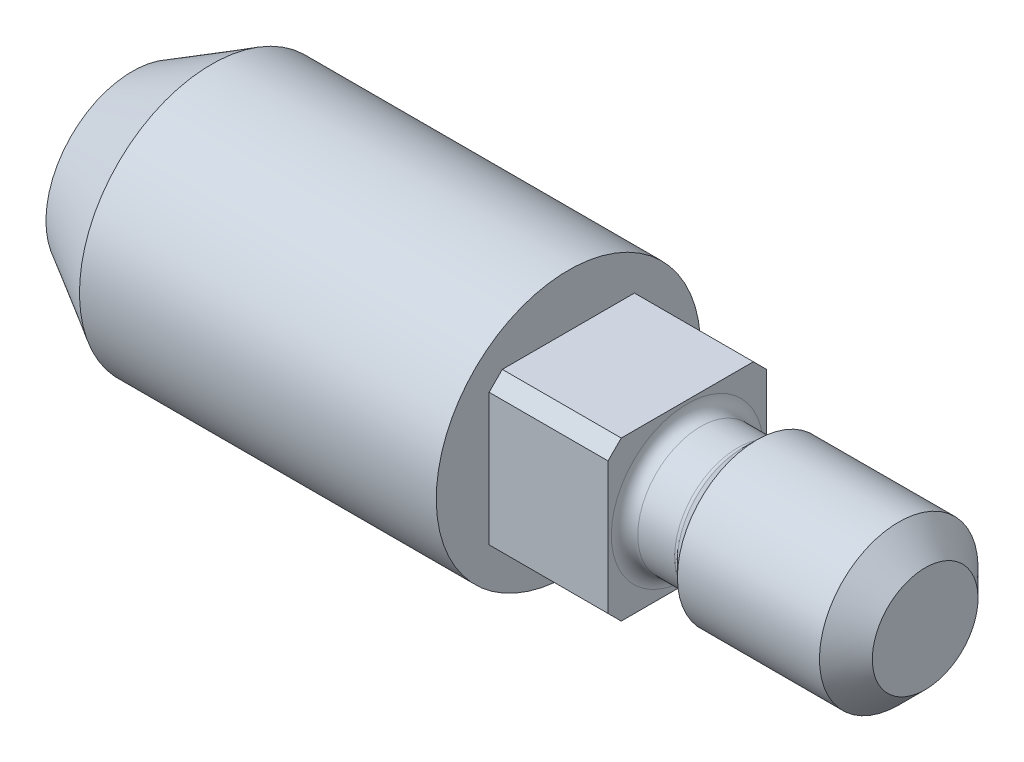
ISO-10303-21;
HEADER;
FILE_DESCRIPTION(('STEP AP214'),'2;1');
FILE_NAME('part.step','',(''),(''),'','','');
FILE_SCHEMA(('AUTOMOTIVE_DESIGN { 1 0 10303 214 1 1 1 1 }'));
ENDSEC;
DATA;
#1=APPLICATION_CONTEXT('core data for automotive mechanical design processes');
#2=APPLICATION_PROTOCOL_DEFINITION('international standard','automotive_design',2000,#1);
#3=PRODUCT_CONTEXT('',#1,'mechanical');
#4=PRODUCT('Part','Part','',(#3));
#5=PRODUCT_RELATED_PRODUCT_CATEGORY('part','',(#4));
#6=PRODUCT_DEFINITION_FORMATION('','',#4);
#7=PRODUCT_DEFINITION_CONTEXT('part definition',#1,'design');
#8=PRODUCT_DEFINITION('design','',#6,#7);
#9=PRODUCT_DEFINITION_SHAPE('','',#8);
#10=(LENGTH_UNIT() NAMED_UNIT(*) SI_UNIT(.MILLI.,.METRE.));
#11=(NAMED_UNIT(*) PLANE_ANGLE_UNIT() SI_UNIT($,.RADIAN.));
#12=(NAMED_UNIT(*) SI_UNIT($,.STERADIAN.) SOLID_ANGLE_UNIT());
#13=UNCERTAINTY_MEASURE_WITH_UNIT(LENGTH_MEASURE(1.E-05),#10,'distance_accuracy_value','');
#14=(GEOMETRIC_REPRESENTATION_CONTEXT(3) GLOBAL_UNCERTAINTY_ASSIGNED_CONTEXT((#13)) GLOBAL_UNIT_ASSIGNED_CONTEXT((#10,
#11,#12)) REPRESENTATION_CONTEXT('',''));
#15=CARTESIAN_POINT('',(0.,0.,0.));
#16=DIRECTION('',(0.,0.,1.));
#17=DIRECTION('',(1.,0.,0.));
#18=AXIS2_PLACEMENT_3D('',#15,#16,#17);
#19=CARTESIAN_POINT('',(60.,6.,0.));
#20=DIRECTION('',(-1.,0.,0.));
#21=DIRECTION('',(0.,-1.,0.));
#22=AXIS2_PLACEMENT_3D('',#19,#20,#21);
#23=PLANE('',#22);
#24=CARTESIAN_POINT('',(60.,0.,0.));
#25=DIRECTION('',(-1.,0.,0.));
#26=DIRECTION('',(0.,-1.,0.));
#27=AXIS2_PLACEMENT_3D('',#24,#25,#26);
#28=CIRCLE('',#27,4.);
#29=CARTESIAN_POINT('',(60.,-4.,0.));
#30=VERTEX_POINT('',#29);
#31=EDGE_CURVE('E13',#30,#30,#28,.F.);
#32=ORIENTED_EDGE('',*,*,#31,.T.);
#33=EDGE_LOOP('',(#32));
#34=FACE_BOUND('',#33,.T.);
#35=ADVANCED_FACE('F53',(#34),#23,.F.);
#36=CARTESIAN_POINT('',(0.,0.,0.));
#37=DIRECTION('',(-1.,0.,0.));
#38=DIRECTION('',(0.,-1.,0.));
#39=AXIS2_PLACEMENT_3D('',#36,#37,#38);
#40=CYLINDRICAL_SURFACE('',#39,6.);
#41=CARTESIAN_POINT('',(58.,0.,0.));
#42=DIRECTION('',(-1.,0.,0.));
#43=DIRECTION('',(0.,-1.,0.));
#44=AXIS2_PLACEMENT_3D('',#41,#42,#43);
#45=CIRCLE('',#44,6.);
#46=CARTESIAN_POINT('',(58.,-6.,0.));
#47=VERTEX_POINT('',#46);
#48=EDGE_CURVE('E61',#47,#47,#45,.T.);
#49=ORIENTED_EDGE('',*,*,#48,.T.);
#50=EDGE_LOOP('',(#49));
#51=FACE_BOUND('',#50,.T.);
#52=CARTESIAN_POINT('',(47.25,0.,0.));
#53=DIRECTION('',(-1.,0.,0.));
#54=DIRECTION('',(0.,-1.,0.));
#55=AXIS2_PLACEMENT_3D('',#52,#53,#54);
#56=CIRCLE('',#55,6.);
#57=CARTESIAN_POINT('',(47.25,-6.,0.));
#58=VERTEX_POINT('',#57);
#59=EDGE_CURVE('E253',#58,#58,#56,.T.);
#60=ORIENTED_EDGE('',*,*,#59,.F.);
#61=EDGE_LOOP('',(#60));
#62=FACE_BOUND('',#61,.T.);
#63=ADVANCED_FACE('F182',(#51,#62),#40,.T.);
#64=CARTESIAN_POINT('',(47.25,0.,0.));
#65=DIRECTION('',(1.,0.,0.));
#66=DIRECTION('',(0.,1.,0.));
#67=AXIS2_PLACEMENT_3D('',#64,#65,#66);
#68=CONICAL_SURFACE('',#67,6.,0.785398163397451);
#69=CARTESIAN_POINT('',(46.1464466094067,0.,0.));
#70=DIRECTION('',(1.,0.,0.));
#71=DIRECTION('',(0.,1.,0.));
#72=AXIS2_PLACEMENT_3D('',#69,#70,#71);
#73=CIRCLE('',#72,4.89644660940673);
#74=CARTESIAN_POINT('',(46.1464466094067,4.89644660940673,0.));
#75=VERTEX_POINT('',#74);
#76=EDGE_CURVE('E177',#75,#75,#73,.T.);
#77=ORIENTED_EDGE('',*,*,#76,.T.);
#78=EDGE_LOOP('',(#77));
#79=FACE_BOUND('',#78,.T.);
#80=ORIENTED_EDGE('',*,*,#59,.T.);
#81=EDGE_LOOP('',(#80));
#82=FACE_BOUND('',#81,.T.);
#83=ADVANCED_FACE('F200',(#79,#82),#68,.T.);
#84=CARTESIAN_POINT('',(0.,0.,0.));
#85=DIRECTION('',(-1.,0.,0.));
#86=DIRECTION('',(0.,-1.,0.));
#87=AXIS2_PLACEMENT_3D('',#84,#85,#86);
#88=CYLINDRICAL_SURFACE('',#87,4.75);
#89=CARTESIAN_POINT('',(45.7928932188135,0.,0.));
#90=DIRECTION('',(-1.,0.,0.));
#91=DIRECTION('',(0.,-1.,0.));
#92=AXIS2_PLACEMENT_3D('',#89,#90,#91);
#93=CIRCLE('',#92,4.75);
#94=CARTESIAN_POINT('',(45.7928932188135,-4.75,0.));
#95=VERTEX_POINT('',#94);
#96=EDGE_CURVE('E174',#95,#95,#93,.T.);
#97=ORIENTED_EDGE('',*,*,#96,.T.);
#98=EDGE_LOOP('',(#97));
#99=FACE_BOUND('',#98,.T.);
#100=CARTESIAN_POINT('',(43.,0.,0.));
#101=DIRECTION('',(-1.,0.,0.));
#102=DIRECTION('',(0.,-1.,0.));
#103=AXIS2_PLACEMENT_3D('',#100,#101,#102);
#104=CIRCLE('',#103,4.75);
#105=CARTESIAN_POINT('',(43.,-4.75,0.));
#106=VERTEX_POINT('',#105);
#107=EDGE_CURVE('E171',#106,#106,#104,.F.);
#108=ORIENTED_EDGE('',*,*,#107,.T.);
#109=EDGE_LOOP('',(#108));
#110=FACE_BOUND('',#109,.T.);
#111=ADVANCED_FACE('F233',(#99,#110),#88,.T.);
#112=CARTESIAN_POINT('',(42.,6.,0.));
#113=DIRECTION('',(-1.,0.,0.));
#114=DIRECTION('',(0.,-1.,0.));
#115=AXIS2_PLACEMENT_3D('',#112,#113,#114);
#116=PLANE('',#115);
#117=CARTESIAN_POINT('',(42.,0.,0.));
#118=DIRECTION('',(-1.,0.,0.));
#119=DIRECTION('',(0.,-1.,0.));
#120=AXIS2_PLACEMENT_3D('',#117,#118,#119);
#121=CIRCLE('',#120,5.75);
#122=CARTESIAN_POINT('',(42.,-5.75,0.));
#123=VERTEX_POINT('',#122);
#124=EDGE_CURVE('E168',#123,#123,#121,.T.);
#125=ORIENTED_EDGE('',*,*,#124,.T.);
#126=EDGE_LOOP('',(#125));
#127=FACE_BOUND('',#126,.T.);
#128=DIRECTION('',(0.,1.,0.));
#129=VECTOR('',#128,1.);
#130=CARTESIAN_POINT('',(42.,-6.,6.));
#131=LINE('',#130,#129);
#132=CARTESIAN_POINT('',(42.,-5.00000000000001,6.));
#133=VERTEX_POINT('',#132);
#134=CARTESIAN_POINT('',(42.,5.00000000000001,6.));
#135=VERTEX_POINT('',#134);
#136=EDGE_CURVE('E142',#133,#135,#131,.T.);
#137=ORIENTED_EDGE('',*,*,#136,.F.);
#138=DIRECTION('',(0.,0.707106781186548,0.707106781186548));
#139=VECTOR('',#138,1.);
#140=CARTESIAN_POINT('',(42.,-6.,5.00000000000001));
#141=LINE('',#140,#139);
#142=CARTESIAN_POINT('',(42.,-6.,5.00000000000001));
#143=VERTEX_POINT('',#142);
#144=EDGE_CURVE('E141',#133,#143,#141,.F.);
#145=ORIENTED_EDGE('',*,*,#144,.T.);
#146=DIRECTION('',(0.,0.,1.));
#147=VECTOR('',#146,1.);
#148=CARTESIAN_POINT('',(42.,-6.,6.));
#149=LINE('',#148,#147);
#150=CARTESIAN_POINT('',(42.,-6.,-5.00000000000001));
#151=VERTEX_POINT('',#150);
#152=EDGE_CURVE('E125',#151,#143,#149,.T.);
#153=ORIENTED_EDGE('',*,*,#152,.F.);
#154=DIRECTION('',(0.,-0.707106781186548,0.707106781186548));
#155=VECTOR('',#154,1.);
#156=CARTESIAN_POINT('',(42.,-5.00000000000001,-6.));
#157=LINE('',#156,#155);
#158=CARTESIAN_POINT('',(42.,-5.00000000000001,-6.));
#159=VERTEX_POINT('',#158);
#160=EDGE_CURVE('E138',#151,#159,#157,.F.);
#161=ORIENTED_EDGE('',*,*,#160,.T.);
#162=DIRECTION('',(0.,-1.,0.));
#163=VECTOR('',#162,1.);
#164=CARTESIAN_POINT('',(42.,-6.,-6.));
#165=LINE('',#164,#163);
#166=CARTESIAN_POINT('',(42.,5.00000000000001,-6.));
#167=VERTEX_POINT('',#166);
#168=EDGE_CURVE('E289',#167,#159,#165,.T.);
#169=ORIENTED_EDGE('',*,*,#168,.F.);
#170=DIRECTION('',(0.,-0.707106781186548,-0.707106781186548));
#171=VECTOR('',#170,1.);
#172=CARTESIAN_POINT('',(42.,6.,-5.00000000000001));
#173=LINE('',#172,#171);
#174=CARTESIAN_POINT('',(42.,6.,-5.00000000000001));
#175=VERTEX_POINT('',#174);
#176=EDGE_CURVE('E148',#167,#175,#173,.F.);
#177=ORIENTED_EDGE('',*,*,#176,.T.);
#178=DIRECTION('',(0.,0.,-1.));
#179=VECTOR('',#178,1.);
#180=CARTESIAN_POINT('',(42.,6.,6.));
#181=LINE('',#180,#179);
#182=CARTESIAN_POINT('',(42.,6.,5.00000000000001));
#183=VERTEX_POINT('',#182);
#184=EDGE_CURVE('E278',#183,#175,#181,.T.);
#185=ORIENTED_EDGE('',*,*,#184,.F.);
#186=DIRECTION('',(0.,0.707106781186548,-0.707106781186548));
#187=VECTOR('',#186,1.);
#188=CARTESIAN_POINT('',(42.,5.00000000000001,6.));
#189=LINE('',#188,#187);
#190=EDGE_CURVE('E152',#183,#135,#189,.F.);
#191=ORIENTED_EDGE('',*,*,#190,.T.);
#192=EDGE_LOOP('',(#137,#145,#153,#161,#169,#177,#185,#191));
#193=FACE_BOUND('',#192,.T.);
#194=ADVANCED_FACE('F136',(#127,#193),#116,.F.);
#195=CARTESIAN_POINT('',(58.9705627484771,-6.,6.));
#196=DIRECTION('',(0.,1.,0.));
#197=DIRECTION('',(-1.,0.,0.));
#198=AXIS2_PLACEMENT_3D('',#195,#196,#197);
#199=PLANE('',#198);
#200=ORIENTED_EDGE('',*,*,#152,.T.);
#201=DIRECTION('',(-1.,0.,0.));
#202=VECTOR('',#201,1.);
#203=CARTESIAN_POINT('',(58.9705627484771,-6.,5.00000000000001));
#204=LINE('',#203,#202);
#205=CARTESIAN_POINT('',(33.,-6.,5.00000000000001));
#206=VERTEX_POINT('',#205);
#207=EDGE_CURVE('E131',#143,#206,#204,.T.);
#208=ORIENTED_EDGE('',*,*,#207,.T.);
#209=DIRECTION('',(0.,0.,-1.));
#210=VECTOR('',#209,1.);
#211=CARTESIAN_POINT('',(33.,-6.,0.));
#212=LINE('',#211,#210);
#213=CARTESIAN_POINT('',(33.,-6.,-5.00000000000001));
#214=VERTEX_POINT('',#213);
#215=EDGE_CURVE('E128',#206,#214,#212,.T.);
#216=ORIENTED_EDGE('',*,*,#215,.T.);
#217=DIRECTION('',(1.,0.,0.));
#218=VECTOR('',#217,1.);
#219=CARTESIAN_POINT('',(58.9705627484771,-6.,-5.00000000000001));
#220=LINE('',#219,#218);
#221=EDGE_CURVE('E121',#214,#151,#220,.T.);
#222=ORIENTED_EDGE('',*,*,#221,.T.);
#223=EDGE_LOOP('',(#200,#208,#216,#222));
#224=FACE_BOUND('',#223,.T.);
#225=ADVANCED_FACE('F123',(#224),#199,.F.);
#226=CARTESIAN_POINT('',(58.9705627484771,-6.,6.));
#227=DIRECTION('',(0.,0.,-1.));
#228=DIRECTION('',(-1.,0.,0.));
#229=AXIS2_PLACEMENT_3D('',#226,#227,#228);
#230=PLANE('',#229);
#231=DIRECTION('',(0.,-1.,0.));
#232=VECTOR('',#231,1.);
#233=CARTESIAN_POINT('',(33.,10.,6.));
#234=LINE('',#233,#232);
#235=CARTESIAN_POINT('',(33.,5.00000000000001,6.));
#236=VERTEX_POINT('',#235);
#237=CARTESIAN_POINT('',(33.,-5.00000000000001,6.));
#238=VERTEX_POINT('',#237);
#239=EDGE_CURVE('E132',#236,#238,#234,.T.);
#240=ORIENTED_EDGE('',*,*,#239,.T.);
#241=DIRECTION('',(1.,0.,0.));
#242=VECTOR('',#241,1.);
#243=CARTESIAN_POINT('',(58.9705627484771,-5.00000000000001,6.));
#244=LINE('',#243,#242);
#245=EDGE_CURVE('E273',#238,#133,#244,.T.);
#246=ORIENTED_EDGE('',*,*,#245,.T.);
#247=ORIENTED_EDGE('',*,*,#136,.T.);
#248=DIRECTION('',(-1.,0.,0.));
#249=VECTOR('',#248,1.);
#250=CARTESIAN_POINT('',(58.9705627484771,5.00000000000001,6.));
#251=LINE('',#250,#249);
#252=EDGE_CURVE('E270',#135,#236,#251,.T.);
#253=ORIENTED_EDGE('',*,*,#252,.T.);
#254=EDGE_LOOP('',(#240,#246,#247,#253));
#255=FACE_BOUND('',#254,.T.);
#256=ADVANCED_FACE('F239',(#255),#230,.F.);
#257=CARTESIAN_POINT('',(58.9705627484771,6.,6.));
#258=DIRECTION('',(0.,-1.,0.));
#259=DIRECTION('',(1.,0.,0.));
#260=AXIS2_PLACEMENT_3D('',#257,#258,#259);
#261=PLANE('',#260);
#262=ORIENTED_EDGE('',*,*,#184,.T.);
#263=DIRECTION('',(-1.,0.,0.));
#264=VECTOR('',#263,1.);
#265=CARTESIAN_POINT('',(58.9705627484771,6.,-5.00000000000001));
#266=LINE('',#265,#264);
#267=CARTESIAN_POINT('',(33.,6.,-5.00000000000001));
#268=VERTEX_POINT('',#267);
#269=EDGE_CURVE('E160',#175,#268,#266,.T.);
#270=ORIENTED_EDGE('',*,*,#269,.T.);
#271=DIRECTION('',(0.,0.,1.));
#272=VECTOR('',#271,1.);
#273=CARTESIAN_POINT('',(33.,6.,0.));
#274=LINE('',#273,#272);
#275=CARTESIAN_POINT('',(33.,6.,5.00000000000001));
#276=VERTEX_POINT('',#275);
#277=EDGE_CURVE('E264',#268,#276,#274,.T.);
#278=ORIENTED_EDGE('',*,*,#277,.T.);
#279=DIRECTION('',(1.,0.,0.));
#280=VECTOR('',#279,1.);
#281=CARTESIAN_POINT('',(58.9705627484771,6.,5.00000000000001));
#282=LINE('',#281,#280);
#283=EDGE_CURVE('E158',#276,#183,#282,.T.);
#284=ORIENTED_EDGE('',*,*,#283,.T.);
#285=EDGE_LOOP('',(#262,#270,#278,#284));
#286=FACE_BOUND('',#285,.T.);
#287=ADVANCED_FACE('F285',(#286),#261,.F.);
#288=CARTESIAN_POINT('',(58.9705627484771,-6.,-6.));
#289=DIRECTION('',(0.,0.,1.));
#290=DIRECTION('',(1.,0.,0.));
#291=AXIS2_PLACEMENT_3D('',#288,#289,#290);
#292=PLANE('',#291);
#293=ORIENTED_EDGE('',*,*,#168,.T.);
#294=DIRECTION('',(-1.,0.,0.));
#295=VECTOR('',#294,1.);
#296=CARTESIAN_POINT('',(58.9705627484771,-5.00000000000001,-6.));
#297=LINE('',#296,#295);
#298=CARTESIAN_POINT('',(33.,-5.00000000000001,-6.));
#299=VERTEX_POINT('',#298);
#300=EDGE_CURVE('E147',#159,#299,#297,.T.);
#301=ORIENTED_EDGE('',*,*,#300,.T.);
#302=DIRECTION('',(0.,1.,0.));
#303=VECTOR('',#302,1.);
#304=CARTESIAN_POINT('',(33.,10.,-6.));
#305=LINE('',#304,#303);
#306=CARTESIAN_POINT('',(33.,5.00000000000001,-6.));
#307=VERTEX_POINT('',#306);
#308=EDGE_CURVE('E254',#299,#307,#305,.T.);
#309=ORIENTED_EDGE('',*,*,#308,.T.);
#310=DIRECTION('',(1.,0.,0.));
#311=VECTOR('',#310,1.);
#312=CARTESIAN_POINT('',(58.9705627484771,5.00000000000001,-6.));
#313=LINE('',#312,#311);
#314=EDGE_CURVE('E150',#307,#167,#313,.T.);
#315=ORIENTED_EDGE('',*,*,#314,.T.);
#316=EDGE_LOOP('',(#293,#301,#309,#315));
#317=FACE_BOUND('',#316,.T.);
#318=ADVANCED_FACE('F208',(#317),#292,.F.);
#319=CARTESIAN_POINT('',(0.,0.,0.));
#320=DIRECTION('',(-1.,0.,0.));
#321=DIRECTION('',(0.,1.,0.));
#322=AXIS2_PLACEMENT_3D('',#319,#320,#321);
#323=SPHERICAL_SURFACE('',#322,6.);
#324=CARTESIAN_POINT('',(0.,0.,0.));
#325=DIRECTION('',(-1.,0.,0.));
#326=DIRECTION('',(0.,-1.,0.));
#327=AXIS2_PLACEMENT_3D('',#324,#325,#326);
#328=CIRCLE('',#327,6.);
#329=CARTESIAN_POINT('',(0.,-6.,0.));
#330=VERTEX_POINT('',#329);
#331=EDGE_CURVE('E290',#330,#330,#328,.T.);
#332=ORIENTED_EDGE('',*,*,#331,.T.);
#333=EDGE_LOOP('',(#332));
#334=FACE_BOUND('',#333,.T.);
#335=ADVANCED_FACE('F204',(#334),#323,.F.);
#336=CARTESIAN_POINT('',(0.,6.,0.));
#337=DIRECTION('',(1.,0.,0.));
#338=DIRECTION('',(0.,1.,0.));
#339=AXIS2_PLACEMENT_3D('',#336,#337,#338);
#340=PLANE('',#339);
#341=ORIENTED_EDGE('',*,*,#331,.F.);
#342=EDGE_LOOP('',(#341));
#343=FACE_BOUND('',#342,.T.);
#344=CARTESIAN_POINT('',(0.,0.,0.));
#345=DIRECTION('',(-1.,0.,0.));
#346=DIRECTION('',(0.,-1.,0.));
#347=AXIS2_PLACEMENT_3D('',#344,#345,#346);
#348=CIRCLE('',#347,6.53589838486223);
#349=CARTESIAN_POINT('',(0.,-6.53589838486223,0.));
#350=VERTEX_POINT('',#349);
#351=EDGE_CURVE('E293',#350,#350,#348,.T.);
#352=ORIENTED_EDGE('',*,*,#351,.T.);
#353=EDGE_LOOP('',(#352));
#354=FACE_BOUND('',#353,.T.);
#355=ADVANCED_FACE('F207',(#343,#354),#340,.F.);
#356=CARTESIAN_POINT('',(6.,0.,0.));
#357=DIRECTION('',(1.,0.,0.));
#358=DIRECTION('',(0.,1.,0.));
#359=AXIS2_PLACEMENT_3D('',#356,#357,#358);
#360=CONICAL_SURFACE('',#359,10.,0.5235987755983);
#361=ORIENTED_EDGE('',*,*,#351,.F.);
#362=EDGE_LOOP('',(#361));
#363=FACE_BOUND('',#362,.T.);
#364=CARTESIAN_POINT('',(6.,0.,0.));
#365=DIRECTION('',(-1.,0.,0.));
#366=DIRECTION('',(0.,-1.,0.));
#367=AXIS2_PLACEMENT_3D('',#364,#365,#366);
#368=CIRCLE('',#367,10.);
#369=CARTESIAN_POINT('',(6.,-10.,0.));
#370=VERTEX_POINT('',#369);
#371=EDGE_CURVE('E260',#370,#370,#368,.T.);
#372=ORIENTED_EDGE('',*,*,#371,.T.);
#373=EDGE_LOOP('',(#372));
#374=FACE_BOUND('',#373,.T.);
#375=ADVANCED_FACE('F301',(#363,#374),#360,.T.);
#376=CARTESIAN_POINT('',(0.,0.,0.));
#377=DIRECTION('',(-1.,0.,0.));
#378=DIRECTION('',(0.,-1.,0.));
#379=AXIS2_PLACEMENT_3D('',#376,#377,#378);
#380=CYLINDRICAL_SURFACE('',#379,10.);
#381=ORIENTED_EDGE('',*,*,#371,.F.);
#382=EDGE_LOOP('',(#381));
#383=FACE_BOUND('',#382,.T.);
#384=CARTESIAN_POINT('',(33.,0.,0.));
#385=DIRECTION('',(-1.,0.,0.));
#386=DIRECTION('',(0.,-1.,0.));
#387=AXIS2_PLACEMENT_3D('',#384,#385,#386);
#388=CIRCLE('',#387,10.);
#389=CARTESIAN_POINT('',(33.,-10.,0.));
#390=VERTEX_POINT('',#389);
#391=EDGE_CURVE('E255',#390,#390,#388,.T.);
#392=ORIENTED_EDGE('',*,*,#391,.T.);
#393=EDGE_LOOP('',(#392));
#394=FACE_BOUND('',#393,.T.);
#395=ADVANCED_FACE('F303',(#383,#394),#380,.T.);
#396=CARTESIAN_POINT('',(33.,10.,0.));
#397=DIRECTION('',(-1.,0.,0.));
#398=DIRECTION('',(0.,-1.,0.));
#399=AXIS2_PLACEMENT_3D('',#396,#397,#398);
#400=PLANE('',#399);
#401=ORIENTED_EDGE('',*,*,#391,.F.);
#402=EDGE_LOOP('',(#401));
#403=FACE_BOUND('',#402,.T.);
#404=ORIENTED_EDGE('',*,*,#239,.F.);
#405=DIRECTION('',(0.,-0.707106781186548,0.707106781186548));
#406=VECTOR('',#405,1.);
#407=CARTESIAN_POINT('',(33.,10.5,0.500000000000003));
#408=LINE('',#407,#406);
#409=EDGE_CURVE('E68',#236,#276,#408,.F.);
#410=ORIENTED_EDGE('',*,*,#409,.T.);
#411=ORIENTED_EDGE('',*,*,#277,.F.);
#412=DIRECTION('',(0.,0.707106781186548,0.707106781186548));
#413=VECTOR('',#412,1.);
#414=CARTESIAN_POINT('',(33.,10.5,-0.500000000000003));
#415=LINE('',#414,#413);
#416=EDGE_CURVE('E76',#268,#307,#415,.F.);
#417=ORIENTED_EDGE('',*,*,#416,.T.);
#418=ORIENTED_EDGE('',*,*,#308,.F.);
#419=DIRECTION('',(0.,0.707106781186548,-0.707106781186548));
#420=VECTOR('',#419,1.);
#421=CARTESIAN_POINT('',(33.,-0.500000000000002,-10.5));
#422=LINE('',#421,#420);
#423=EDGE_CURVE('E164',#299,#214,#422,.F.);
#424=ORIENTED_EDGE('',*,*,#423,.T.);
#425=ORIENTED_EDGE('',*,*,#215,.F.);
#426=DIRECTION('',(0.,-0.707106781186548,-0.707106781186548));
#427=VECTOR('',#426,1.);
#428=CARTESIAN_POINT('',(33.,-0.500000000000002,10.5));
#429=LINE('',#428,#427);
#430=EDGE_CURVE('E162',#206,#238,#429,.F.);
#431=ORIENTED_EDGE('',*,*,#430,.T.);
#432=EDGE_LOOP('',(#404,#410,#411,#417,#418,#424,#425,#431));
#433=FACE_BOUND('',#432,.T.);
#434=ADVANCED_FACE('F213',(#403,#433),#400,.F.);
#435=CARTESIAN_POINT('',(58.9705627484771,-6.,5.00000000000001));
#436=DIRECTION('',(0.,0.707106781186547,-0.707106781186547));
#437=DIRECTION('',(-1.,0.,0.));
#438=AXIS2_PLACEMENT_3D('',#435,#436,#437);
#439=PLANE('',#438);
#440=ORIENTED_EDGE('',*,*,#144,.F.);
#441=ORIENTED_EDGE('',*,*,#245,.F.);
#442=ORIENTED_EDGE('',*,*,#430,.F.);
#443=ORIENTED_EDGE('',*,*,#207,.F.);
#444=EDGE_LOOP('',(#440,#441,#442,#443));
#445=FACE_BOUND('',#444,.T.);
#446=ADVANCED_FACE('F210',(#445),#439,.F.);
#447=CARTESIAN_POINT('',(58.9705627484771,-5.00000000000001,-6.));
#448=DIRECTION('',(0.,0.707106781186547,0.707106781186547));
#449=DIRECTION('',(-1.,0.,0.));
#450=AXIS2_PLACEMENT_3D('',#447,#448,#449);
#451=PLANE('',#450);
#452=ORIENTED_EDGE('',*,*,#160,.F.);
#453=ORIENTED_EDGE('',*,*,#221,.F.);
#454=ORIENTED_EDGE('',*,*,#423,.F.);
#455=ORIENTED_EDGE('',*,*,#300,.F.);
#456=EDGE_LOOP('',(#452,#453,#454,#455));
#457=FACE_BOUND('',#456,.T.);
#458=ADVANCED_FACE('F145',(#457),#451,.F.);
#459=CARTESIAN_POINT('',(58.9705627484771,6.,-5.00000000000001));
#460=DIRECTION('',(0.,-0.707106781186547,0.707106781186547));
#461=DIRECTION('',(-1.,0.,0.));
#462=AXIS2_PLACEMENT_3D('',#459,#460,#461);
#463=PLANE('',#462);
#464=ORIENTED_EDGE('',*,*,#176,.F.);
#465=ORIENTED_EDGE('',*,*,#314,.F.);
#466=ORIENTED_EDGE('',*,*,#416,.F.);
#467=ORIENTED_EDGE('',*,*,#269,.F.);
#468=EDGE_LOOP('',(#464,#465,#466,#467));
#469=FACE_BOUND('',#468,.T.);
#470=ADVANCED_FACE('F217',(#469),#463,.F.);
#471=CARTESIAN_POINT('',(58.9705627484771,5.00000000000001,6.));
#472=DIRECTION('',(0.,-0.707106781186547,-0.707106781186547));
#473=DIRECTION('',(-1.,0.,0.));
#474=AXIS2_PLACEMENT_3D('',#471,#472,#473);
#475=PLANE('',#474);
#476=ORIENTED_EDGE('',*,*,#190,.F.);
#477=ORIENTED_EDGE('',*,*,#283,.F.);
#478=ORIENTED_EDGE('',*,*,#409,.F.);
#479=ORIENTED_EDGE('',*,*,#252,.F.);
#480=EDGE_LOOP('',(#476,#477,#478,#479));
#481=FACE_BOUND('',#480,.T.);
#482=ADVANCED_FACE('F220',(#481),#475,.F.);
#483=CARTESIAN_POINT('',(43.,0.,0.));
#484=DIRECTION('',(-1.,0.,0.));
#485=DIRECTION('',(0.,-1.,0.));
#486=AXIS2_PLACEMENT_3D('',#483,#484,#485);
#487=TOROIDAL_SURFACE('',#486,5.75,1.);
#488=ORIENTED_EDGE('',*,*,#107,.F.);
#489=EDGE_LOOP('',(#488));
#490=FACE_BOUND('',#489,.T.);
#491=ORIENTED_EDGE('',*,*,#124,.F.);
#492=EDGE_LOOP('',(#491));
#493=FACE_BOUND('',#492,.T.);
#494=ADVANCED_FACE('F191',(#490,#493),#487,.F.);
#495=CARTESIAN_POINT('',(45.7928932188135,0.,0.));
#496=DIRECTION('',(-1.,0.,0.));
#497=DIRECTION('',(0.,-1.,0.));
#498=AXIS2_PLACEMENT_3D('',#495,#496,#497);
#499=TOROIDAL_SURFACE('',#498,5.25,0.5);
#500=ORIENTED_EDGE('',*,*,#76,.F.);
#501=EDGE_LOOP('',(#500));
#502=FACE_BOUND('',#501,.T.);
#503=ORIENTED_EDGE('',*,*,#96,.F.);
#504=EDGE_LOOP('',(#503));
#505=FACE_BOUND('',#504,.T.);
#506=ADVANCED_FACE('F186',(#502,#505),#499,.F.);
#507=CARTESIAN_POINT('',(58.,0.,0.));
#508=DIRECTION('',(-1.,0.,0.));
#509=DIRECTION('',(0.,-1.,0.));
#510=AXIS2_PLACEMENT_3D('',#507,#508,#509);
#511=CONICAL_SURFACE('',#510,6.,0.78539816339745);
#512=ORIENTED_EDGE('',*,*,#31,.F.);
#513=EDGE_LOOP('',(#512));
#514=FACE_BOUND('',#513,.T.);
#515=ORIENTED_EDGE('',*,*,#48,.F.);
#516=EDGE_LOOP('',(#515));
#517=FACE_BOUND('',#516,.T.);
#518=ADVANCED_FACE('F55',(#514,#517),#511,.T.);
#519=CLOSED_SHELL('',(#35,#63,#83,#111,#194,#225,#256,#287,#318,#335,#355,#375,#395,#434,#446,
#458,#470,#482,#494,#506,#518));
#520=MANIFOLD_SOLID_BREP('B2',#519);
#521=ADVANCED_BREP_SHAPE_REPRESENTATION('',(#18,#520),#14);
#522=SHAPE_DEFINITION_REPRESENTATION(#9,#521);
ENDSEC;
END-ISO-10303-21;
